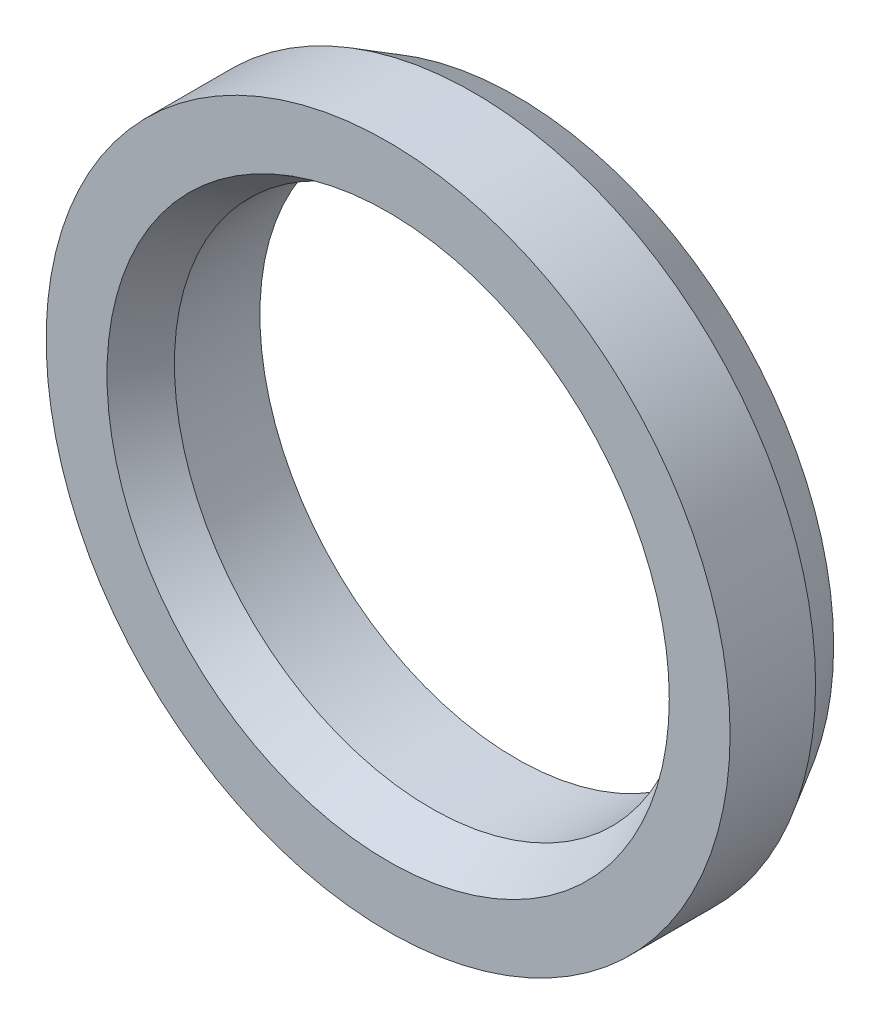
ISO-10303-21;
HEADER;
FILE_DESCRIPTION(('STEP AP214'),'2;1');
FILE_NAME('part.step','',(''),(''),'','','');
FILE_SCHEMA(('AUTOMOTIVE_DESIGN { 1 0 10303 214 1 1 1 1 }'));
ENDSEC;
DATA;
#1=APPLICATION_CONTEXT('core data for automotive mechanical design processes');
#2=APPLICATION_PROTOCOL_DEFINITION('international standard','automotive_design',2000,#1);
#3=PRODUCT_CONTEXT('',#1,'mechanical');
#4=PRODUCT('Part','Part','',(#3));
#5=PRODUCT_RELATED_PRODUCT_CATEGORY('part','',(#4));
#6=PRODUCT_DEFINITION_FORMATION('','',#4);
#7=PRODUCT_DEFINITION_CONTEXT('part definition',#1,'design');
#8=PRODUCT_DEFINITION('design','',#6,#7);
#9=PRODUCT_DEFINITION_SHAPE('','',#8);
#10=(LENGTH_UNIT() NAMED_UNIT(*) SI_UNIT(.MILLI.,.METRE.));
#11=(NAMED_UNIT(*) PLANE_ANGLE_UNIT() SI_UNIT($,.RADIAN.));
#12=(NAMED_UNIT(*) SI_UNIT($,.STERADIAN.) SOLID_ANGLE_UNIT());
#13=UNCERTAINTY_MEASURE_WITH_UNIT(LENGTH_MEASURE(1.E-05),#10,'distance_accuracy_value','');
#14=(GEOMETRIC_REPRESENTATION_CONTEXT(3) GLOBAL_UNCERTAINTY_ASSIGNED_CONTEXT((#13)) GLOBAL_UNIT_ASSIGNED_CONTEXT((#10,
#11,#12)) REPRESENTATION_CONTEXT('',''));
#15=CARTESIAN_POINT('',(0.,0.,0.));
#16=DIRECTION('',(0.,0.,1.));
#17=DIRECTION('',(1.,0.,0.));
#18=AXIS2_PLACEMENT_3D('',#15,#16,#17);
#19=CARTESIAN_POINT('',(0.,0.,0.));
#20=DIRECTION('',(0.,0.,1.));
#21=DIRECTION('',(1.,0.,0.));
#22=AXIS2_PLACEMENT_3D('',#19,#20,#21);
#23=CYLINDRICAL_SURFACE('',#22,3.);
#24=CARTESIAN_POINT('',(0.,0.,-0.5));
#25=DIRECTION('',(0.,0.,1.));
#26=DIRECTION('',(1.,0.,0.));
#27=AXIS2_PLACEMENT_3D('',#24,#25,#26);
#28=CIRCLE('',#27,3.);
#29=CARTESIAN_POINT('',(3.,0.,-0.5));
#30=VERTEX_POINT('',#29);
#31=EDGE_CURVE('E46',#30,#30,#28,.T.);
#32=ORIENTED_EDGE('',*,*,#31,.T.);
#33=EDGE_LOOP('',(#32));
#34=FACE_BOUND('',#33,.T.);
#35=CARTESIAN_POINT('',(0.,0.,-1.5));
#36=DIRECTION('',(0.,0.,1.));
#37=DIRECTION('',(1.,0.,0.));
#38=AXIS2_PLACEMENT_3D('',#35,#36,#37);
#39=CIRCLE('',#38,3.);
#40=CARTESIAN_POINT('',(3.,0.,-1.5));
#41=VERTEX_POINT('',#40);
#42=EDGE_CURVE('E64',#41,#41,#39,.T.);
#43=ORIENTED_EDGE('',*,*,#42,.F.);
#44=EDGE_LOOP('',(#43));
#45=FACE_BOUND('',#44,.T.);
#46=ADVANCED_FACE('F39',(#34,#45),#23,.F.);
#47=CARTESIAN_POINT('',(0.,3.,0.));
#48=DIRECTION('',(0.,0.,1.));
#49=DIRECTION('',(1.,0.,0.));
#50=AXIS2_PLACEMENT_3D('',#47,#48,#49);
#51=PLANE('',#50);
#52=CARTESIAN_POINT('',(0.,0.,0.));
#53=DIRECTION('',(0.,0.,1.));
#54=DIRECTION('',(1.,0.,0.));
#55=AXIS2_PLACEMENT_3D('',#52,#53,#54);
#56=CIRCLE('',#55,3.28867513459481);
#57=CARTESIAN_POINT('',(3.28867513459481,0.,0.));
#58=VERTEX_POINT('',#57);
#59=EDGE_CURVE('E10',#58,#58,#56,.F.);
#60=ORIENTED_EDGE('',*,*,#59,.T.);
#61=EDGE_LOOP('',(#60));
#62=FACE_BOUND('',#61,.T.);
#63=CARTESIAN_POINT('',(0.,0.,0.));
#64=DIRECTION('',(0.,0.,1.));
#65=DIRECTION('',(1.,0.,0.));
#66=AXIS2_PLACEMENT_3D('',#63,#64,#65);
#67=CIRCLE('',#66,4.);
#68=CARTESIAN_POINT('',(4.,0.,0.));
#69=VERTEX_POINT('',#68);
#70=EDGE_CURVE('E61',#69,#69,#67,.T.);
#71=ORIENTED_EDGE('',*,*,#70,.T.);
#72=EDGE_LOOP('',(#71));
#73=FACE_BOUND('',#72,.T.);
#74=ADVANCED_FACE('F72',(#62,#73),#51,.T.);
#75=CARTESIAN_POINT('',(0.,0.,0.));
#76=DIRECTION('',(0.,0.,1.));
#77=DIRECTION('',(1.,0.,0.));
#78=AXIS2_PLACEMENT_3D('',#75,#76,#77);
#79=CYLINDRICAL_SURFACE('',#78,4.);
#80=CARTESIAN_POINT('',(0.,0.,-1.));
#81=DIRECTION('',(0.,0.,-1.));
#82=DIRECTION('',(-1.,0.,0.));
#83=AXIS2_PLACEMENT_3D('',#80,#81,#82);
#84=CIRCLE('',#83,4.);
#85=CARTESIAN_POINT('',(-4.,0.,-1.));
#86=VERTEX_POINT('',#85);
#87=EDGE_CURVE('E55',#86,#86,#84,.F.);
#88=ORIENTED_EDGE('',*,*,#87,.T.);
#89=EDGE_LOOP('',(#88));
#90=FACE_BOUND('',#89,.T.);
#91=ORIENTED_EDGE('',*,*,#70,.F.);
#92=EDGE_LOOP('',(#91));
#93=FACE_BOUND('',#92,.T.);
#94=ADVANCED_FACE('F77',(#90,#93),#79,.T.);
#95=CARTESIAN_POINT('',(0.,4.,-1.5));
#96=DIRECTION('',(0.,0.,-1.));
#97=DIRECTION('',(-1.,0.,0.));
#98=AXIS2_PLACEMENT_3D('',#95,#96,#97);
#99=PLANE('',#98);
#100=CARTESIAN_POINT('',(0.,0.,-1.5));
#101=DIRECTION('',(0.,0.,-1.));
#102=DIRECTION('',(-1.,0.,0.));
#103=AXIS2_PLACEMENT_3D('',#100,#101,#102);
#104=CIRCLE('',#103,3.71132486540519);
#105=CARTESIAN_POINT('',(-3.71132486540519,0.,-1.5));
#106=VERTEX_POINT('',#105);
#107=EDGE_CURVE('E50',#106,#106,#104,.T.);
#108=ORIENTED_EDGE('',*,*,#107,.T.);
#109=EDGE_LOOP('',(#108));
#110=FACE_BOUND('',#109,.T.);
#111=ORIENTED_EDGE('',*,*,#42,.T.);
#112=EDGE_LOOP('',(#111));
#113=FACE_BOUND('',#112,.T.);
#114=ADVANCED_FACE('F69',(#110,#113),#99,.T.);
#115=CARTESIAN_POINT('',(0.,0.,-1.));
#116=DIRECTION('',(0.,0.,1.));
#117=DIRECTION('',(1.,0.,0.));
#118=AXIS2_PLACEMENT_3D('',#115,#116,#117);
#119=CONICAL_SURFACE('',#118,4.,0.523598775598294);
#120=ORIENTED_EDGE('',*,*,#107,.F.);
#121=EDGE_LOOP('',(#120));
#122=FACE_BOUND('',#121,.T.);
#123=ORIENTED_EDGE('',*,*,#87,.F.);
#124=EDGE_LOOP('',(#123));
#125=FACE_BOUND('',#124,.T.);
#126=ADVANCED_FACE('F80',(#122,#125),#119,.T.);
#127=CARTESIAN_POINT('',(0.,0.,-0.5));
#128=DIRECTION('',(0.,0.,1.));
#129=DIRECTION('',(1.,0.,0.));
#130=AXIS2_PLACEMENT_3D('',#127,#128,#129);
#131=CONICAL_SURFACE('',#130,3.,0.523598775598296);
#132=ORIENTED_EDGE('',*,*,#59,.F.);
#133=EDGE_LOOP('',(#132));
#134=FACE_BOUND('',#133,.T.);
#135=ORIENTED_EDGE('',*,*,#31,.F.);
#136=EDGE_LOOP('',(#135));
#137=FACE_BOUND('',#136,.T.);
#138=ADVANCED_FACE('F41',(#134,#137),#131,.F.);
#139=CLOSED_SHELL('',(#46,#74,#94,#114,#126,#138));
#140=MANIFOLD_SOLID_BREP('B2',#139);
#141=ADVANCED_BREP_SHAPE_REPRESENTATION('',(#18,#140),#14);
#142=SHAPE_DEFINITION_REPRESENTATION(#9,#141);
ENDSEC;
END-ISO-10303-21;
